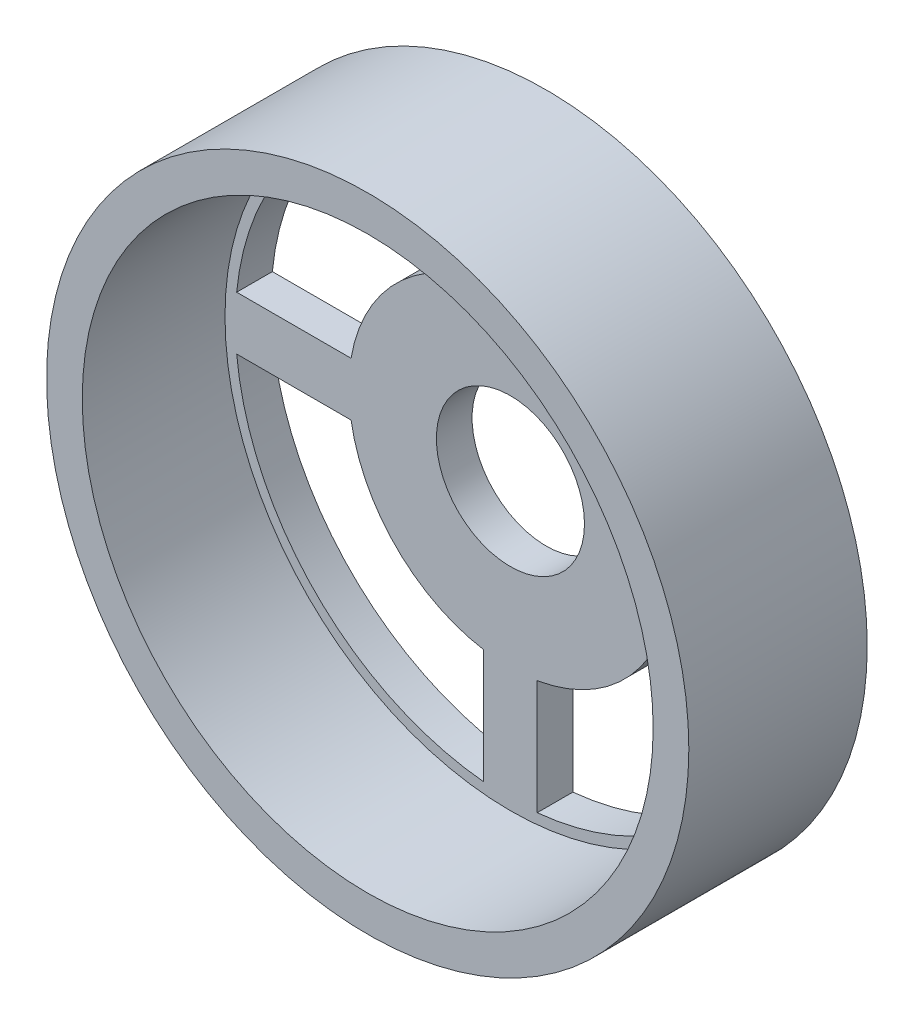
ISO-10303-21;
HEADER;
FILE_DESCRIPTION(('STEP AP214'),'2;1');
FILE_NAME('part.step','',(''),(''),'','','');
FILE_SCHEMA(('AUTOMOTIVE_DESIGN { 1 0 10303 214 1 1 1 1 }'));
ENDSEC;
DATA;
#1=APPLICATION_CONTEXT('core data for automotive mechanical design processes');
#2=APPLICATION_PROTOCOL_DEFINITION('international standard','automotive_design',2000,#1);
#3=PRODUCT_CONTEXT('',#1,'mechanical');
#4=PRODUCT('Part','Part','',(#3));
#5=PRODUCT_RELATED_PRODUCT_CATEGORY('part','',(#4));
#6=PRODUCT_DEFINITION_FORMATION('','',#4);
#7=PRODUCT_DEFINITION_CONTEXT('part definition',#1,'design');
#8=PRODUCT_DEFINITION('design','',#6,#7);
#9=PRODUCT_DEFINITION_SHAPE('','',#8);
#10=(LENGTH_UNIT() NAMED_UNIT(*) SI_UNIT(.MILLI.,.METRE.));
#11=(NAMED_UNIT(*) PLANE_ANGLE_UNIT() SI_UNIT($,.RADIAN.));
#12=(NAMED_UNIT(*) SI_UNIT($,.STERADIAN.) SOLID_ANGLE_UNIT());
#13=UNCERTAINTY_MEASURE_WITH_UNIT(LENGTH_MEASURE(1.E-05),#10,'distance_accuracy_value','');
#14=(GEOMETRIC_REPRESENTATION_CONTEXT(3) GLOBAL_UNCERTAINTY_ASSIGNED_CONTEXT((#13)) GLOBAL_UNIT_ASSIGNED_CONTEXT((#10,
#11,#12)) REPRESENTATION_CONTEXT('',''));
#15=CARTESIAN_POINT('',(0.,0.,0.));
#16=DIRECTION('',(0.,0.,1.));
#17=DIRECTION('',(1.,0.,0.));
#18=AXIS2_PLACEMENT_3D('',#15,#16,#17);
#19=CARTESIAN_POINT('',(0.,0.,2.));
#20=DIRECTION('',(0.,0.,1.));
#21=DIRECTION('',(1.,0.,0.));
#22=AXIS2_PLACEMENT_3D('',#19,#20,#21);
#23=PLANE('',#22);
#24=DIRECTION('',(0.,-1.,0.));
#25=VECTOR('',#24,1.);
#26=CARTESIAN_POINT('',(1.5,0.,2.));
#27=LINE('',#26,#25);
#28=CARTESIAN_POINT('',(1.5,15.3443381778024,2.));
#29=VERTEX_POINT('',#28);
#30=CARTESIAN_POINT('',(1.5,8.9322223454031,2.));
#31=VERTEX_POINT('',#30);
#32=EDGE_CURVE('E278',#29,#31,#27,.T.);
#33=ORIENTED_EDGE('',*,*,#32,.F.);
#34=CARTESIAN_POINT('',(0.,0.,2.));
#35=DIRECTION('',(0.,0.,1.));
#36=DIRECTION('',(1.,0.,0.));
#37=AXIS2_PLACEMENT_3D('',#34,#35,#36);
#38=CIRCLE('',#37,15.4174807966401);
#39=CARTESIAN_POINT('',(15.3443381778024,1.5,2.));
#40=VERTEX_POINT('',#39);
#41=EDGE_CURVE('E270',#40,#29,#38,.T.);
#42=ORIENTED_EDGE('',*,*,#41,.F.);
#43=DIRECTION('',(-1.,0.,0.));
#44=VECTOR('',#43,1.);
#45=CARTESIAN_POINT('',(0.,1.5,2.));
#46=LINE('',#45,#44);
#47=CARTESIAN_POINT('',(8.9322223454031,1.5,2.));
#48=VERTEX_POINT('',#47);
#49=EDGE_CURVE('E272',#40,#48,#46,.T.);
#50=ORIENTED_EDGE('',*,*,#49,.T.);
#51=CARTESIAN_POINT('',(0.,0.,2.));
#52=DIRECTION('',(0.,0.,1.));
#53=DIRECTION('',(1.,0.,0.));
#54=AXIS2_PLACEMENT_3D('',#51,#52,#53);
#55=CIRCLE('',#54,9.05729518276392);
#56=EDGE_CURVE('E275',#48,#31,#55,.T.);
#57=ORIENTED_EDGE('',*,*,#56,.T.);
#58=EDGE_LOOP('',(#33,#42,#50,#57));
#59=FACE_BOUND('',#58,.T.);
#60=DIRECTION('',(-1.,0.,0.));
#61=VECTOR('',#60,1.);
#62=CARTESIAN_POINT('',(0.,-1.5,2.));
#63=LINE('',#62,#61);
#64=CARTESIAN_POINT('',(15.3443381778024,-1.5,2.));
#65=VERTEX_POINT('',#64);
#66=CARTESIAN_POINT('',(8.9322223454031,-1.5,2.));
#67=VERTEX_POINT('',#66);
#68=EDGE_CURVE('E249',#65,#67,#63,.T.);
#69=ORIENTED_EDGE('',*,*,#68,.F.);
#70=CARTESIAN_POINT('',(0.,0.,2.));
#71=DIRECTION('',(0.,0.,1.));
#72=DIRECTION('',(1.,0.,0.));
#73=AXIS2_PLACEMENT_3D('',#70,#71,#72);
#74=CIRCLE('',#73,15.4174807966401);
#75=CARTESIAN_POINT('',(1.5,-15.3443381778024,2.));
#76=VERTEX_POINT('',#75);
#77=EDGE_CURVE('E235',#76,#65,#74,.T.);
#78=ORIENTED_EDGE('',*,*,#77,.F.);
#79=DIRECTION('',(0.,1.,0.));
#80=VECTOR('',#79,1.);
#81=CARTESIAN_POINT('',(1.5,0.,2.));
#82=LINE('',#81,#80);
#83=CARTESIAN_POINT('',(1.5,-8.9322223454031,2.));
#84=VERTEX_POINT('',#83);
#85=EDGE_CURVE('E243',#76,#84,#82,.T.);
#86=ORIENTED_EDGE('',*,*,#85,.T.);
#87=CARTESIAN_POINT('',(0.,0.,2.));
#88=DIRECTION('',(0.,0.,1.));
#89=DIRECTION('',(1.,0.,0.));
#90=AXIS2_PLACEMENT_3D('',#87,#88,#89);
#91=CIRCLE('',#90,9.05729518276392);
#92=EDGE_CURVE('E246',#84,#67,#91,.T.);
#93=ORIENTED_EDGE('',*,*,#92,.T.);
#94=EDGE_LOOP('',(#69,#78,#86,#93));
#95=FACE_BOUND('',#94,.T.);
#96=CARTESIAN_POINT('',(0.,0.,2.));
#97=DIRECTION('',(0.,0.,1.));
#98=DIRECTION('',(1.,0.,0.));
#99=AXIS2_PLACEMENT_3D('',#96,#97,#98);
#100=CIRCLE('',#99,16.);
#101=CARTESIAN_POINT('',(16.,0.,2.));
#102=VERTEX_POINT('',#101);
#103=EDGE_CURVE('E287',#102,#102,#100,.F.);
#104=ORIENTED_EDGE('',*,*,#103,.F.);
#105=EDGE_LOOP('',(#104));
#106=FACE_BOUND('',#105,.T.);
#107=CARTESIAN_POINT('',(0.,0.,2.));
#108=DIRECTION('',(0.,0.,1.));
#109=DIRECTION('',(1.,0.,0.));
#110=AXIS2_PLACEMENT_3D('',#107,#108,#109);
#111=CIRCLE('',#110,4.15);
#112=CARTESIAN_POINT('',(4.15,0.,2.));
#113=VERTEX_POINT('',#112);
#114=EDGE_CURVE('E11',#113,#113,#111,.T.);
#115=ORIENTED_EDGE('',*,*,#114,.F.);
#116=EDGE_LOOP('',(#115));
#117=FACE_BOUND('',#116,.T.);
#118=DIRECTION('',(1.,0.,0.));
#119=VECTOR('',#118,1.);
#120=CARTESIAN_POINT('',(0.,-1.5,2.));
#121=LINE('',#120,#119);
#122=CARTESIAN_POINT('',(-15.3443381778024,-1.5,2.));
#123=VERTEX_POINT('',#122);
#124=CARTESIAN_POINT('',(-8.9322223454031,-1.5,2.));
#125=VERTEX_POINT('',#124);
#126=EDGE_CURVE('E254',#123,#125,#121,.T.);
#127=ORIENTED_EDGE('',*,*,#126,.T.);
#128=CARTESIAN_POINT('',(0.,0.,2.));
#129=DIRECTION('',(0.,0.,1.));
#130=DIRECTION('',(1.,0.,0.));
#131=AXIS2_PLACEMENT_3D('',#128,#129,#130);
#132=CIRCLE('',#131,9.05729518276392);
#133=CARTESIAN_POINT('',(-1.5,-8.9322223454031,2.));
#134=VERTEX_POINT('',#133);
#135=EDGE_CURVE('E257',#125,#134,#132,.T.);
#136=ORIENTED_EDGE('',*,*,#135,.T.);
#137=DIRECTION('',(0.,1.,0.));
#138=VECTOR('',#137,1.);
#139=CARTESIAN_POINT('',(-1.5,0.,2.));
#140=LINE('',#139,#138);
#141=CARTESIAN_POINT('',(-1.5,-15.3443381778024,2.));
#142=VERTEX_POINT('',#141);
#143=EDGE_CURVE('E251',#142,#134,#140,.T.);
#144=ORIENTED_EDGE('',*,*,#143,.F.);
#145=CARTESIAN_POINT('',(0.,0.,2.));
#146=DIRECTION('',(0.,0.,1.));
#147=DIRECTION('',(1.,0.,0.));
#148=AXIS2_PLACEMENT_3D('',#145,#146,#147);
#149=CIRCLE('',#148,15.4174807966401);
#150=EDGE_CURVE('E158',#123,#142,#149,.T.);
#151=ORIENTED_EDGE('',*,*,#150,.F.);
#152=EDGE_LOOP('',(#127,#136,#144,#151));
#153=FACE_BOUND('',#152,.T.);
#154=DIRECTION('',(0.,-1.,0.));
#155=VECTOR('',#154,1.);
#156=CARTESIAN_POINT('',(-1.5,0.,2.));
#157=LINE('',#156,#155);
#158=CARTESIAN_POINT('',(-1.5,15.3443381778024,2.));
#159=VERTEX_POINT('',#158);
#160=CARTESIAN_POINT('',(-1.5,8.9322223454031,2.));
#161=VERTEX_POINT('',#160);
#162=EDGE_CURVE('E264',#159,#161,#157,.T.);
#163=ORIENTED_EDGE('',*,*,#162,.T.);
#164=CARTESIAN_POINT('',(0.,0.,2.));
#165=DIRECTION('',(0.,0.,1.));
#166=DIRECTION('',(1.,0.,0.));
#167=AXIS2_PLACEMENT_3D('',#164,#165,#166);
#168=CIRCLE('',#167,9.05729518276392);
#169=CARTESIAN_POINT('',(-8.9322223454031,1.5,2.));
#170=VERTEX_POINT('',#169);
#171=EDGE_CURVE('E267',#161,#170,#168,.T.);
#172=ORIENTED_EDGE('',*,*,#171,.T.);
#173=DIRECTION('',(1.,0.,0.));
#174=VECTOR('',#173,1.);
#175=CARTESIAN_POINT('',(0.,1.5,2.));
#176=LINE('',#175,#174);
#177=CARTESIAN_POINT('',(-15.3443381778024,1.5,2.));
#178=VERTEX_POINT('',#177);
#179=EDGE_CURVE('E260',#178,#170,#176,.T.);
#180=ORIENTED_EDGE('',*,*,#179,.F.);
#181=CARTESIAN_POINT('',(0.,0.,2.));
#182=DIRECTION('',(0.,0.,1.));
#183=DIRECTION('',(1.,0.,0.));
#184=AXIS2_PLACEMENT_3D('',#181,#182,#183);
#185=CIRCLE('',#184,15.4174807966401);
#186=EDGE_CURVE('E262',#159,#178,#185,.T.);
#187=ORIENTED_EDGE('',*,*,#186,.F.);
#188=EDGE_LOOP('',(#163,#172,#180,#187));
#189=FACE_BOUND('',#188,.T.);
#190=ADVANCED_FACE('F37',(#59,#95,#106,#117,#153,#189),#23,.T.);
#191=CARTESIAN_POINT('',(0.,0.,0.));
#192=DIRECTION('',(0.,0.,1.));
#193=DIRECTION('',(1.,0.,0.));
#194=AXIS2_PLACEMENT_3D('',#191,#192,#193);
#195=PLANE('',#194);
#196=CARTESIAN_POINT('',(0.,0.,0.));
#197=DIRECTION('',(0.,0.,-1.));
#198=DIRECTION('',(-1.,0.,0.));
#199=AXIS2_PLACEMENT_3D('',#196,#197,#198);
#200=CIRCLE('',#199,15.4174807966401);
#201=CARTESIAN_POINT('',(1.5,15.3443381778024,0.));
#202=VERTEX_POINT('',#201);
#203=CARTESIAN_POINT('',(15.3443381778024,1.5,0.));
#204=VERTEX_POINT('',#203);
#205=EDGE_CURVE('E207',#202,#204,#200,.T.);
#206=ORIENTED_EDGE('',*,*,#205,.F.);
#207=DIRECTION('',(0.,1.,0.));
#208=VECTOR('',#207,1.);
#209=CARTESIAN_POINT('',(1.5,0.,0.));
#210=LINE('',#209,#208);
#211=CARTESIAN_POINT('',(1.5,8.9322223454031,0.));
#212=VERTEX_POINT('',#211);
#213=EDGE_CURVE('E205',#212,#202,#210,.T.);
#214=ORIENTED_EDGE('',*,*,#213,.F.);
#215=CARTESIAN_POINT('',(0.,0.,0.));
#216=DIRECTION('',(0.,0.,-1.));
#217=DIRECTION('',(-1.,0.,0.));
#218=AXIS2_PLACEMENT_3D('',#215,#216,#217);
#219=CIRCLE('',#218,9.05729518276392);
#220=CARTESIAN_POINT('',(8.9322223454031,1.5,0.));
#221=VERTEX_POINT('',#220);
#222=EDGE_CURVE('E212',#212,#221,#219,.T.);
#223=ORIENTED_EDGE('',*,*,#222,.T.);
#224=DIRECTION('',(1.,0.,0.));
#225=VECTOR('',#224,1.);
#226=CARTESIAN_POINT('',(0.,1.5,0.));
#227=LINE('',#226,#225);
#228=EDGE_CURVE('E209',#221,#204,#227,.T.);
#229=ORIENTED_EDGE('',*,*,#228,.T.);
#230=EDGE_LOOP('',(#206,#214,#223,#229));
#231=FACE_BOUND('',#230,.T.);
#232=CARTESIAN_POINT('',(0.,0.,0.));
#233=DIRECTION('',(0.,0.,-1.));
#234=DIRECTION('',(-1.,0.,0.));
#235=AXIS2_PLACEMENT_3D('',#232,#233,#234);
#236=CIRCLE('',#235,9.05729518276392);
#237=CARTESIAN_POINT('',(-1.5,-8.9322223454031,0.));
#238=VERTEX_POINT('',#237);
#239=CARTESIAN_POINT('',(-8.9322223454031,-1.5,0.));
#240=VERTEX_POINT('',#239);
#241=EDGE_CURVE('E171',#238,#240,#236,.T.);
#242=ORIENTED_EDGE('',*,*,#241,.T.);
#243=DIRECTION('',(-1.,0.,0.));
#244=VECTOR('',#243,1.);
#245=CARTESIAN_POINT('',(0.,-1.5,0.));
#246=LINE('',#245,#244);
#247=CARTESIAN_POINT('',(-15.3443381778024,-1.5,0.));
#248=VERTEX_POINT('',#247);
#249=EDGE_CURVE('E175',#240,#248,#246,.T.);
#250=ORIENTED_EDGE('',*,*,#249,.T.);
#251=CARTESIAN_POINT('',(0.,0.,0.));
#252=DIRECTION('',(0.,0.,-1.));
#253=DIRECTION('',(-1.,0.,0.));
#254=AXIS2_PLACEMENT_3D('',#251,#252,#253);
#255=CIRCLE('',#254,15.4174807966401);
#256=CARTESIAN_POINT('',(-1.5,-15.3443381778024,0.));
#257=VERTEX_POINT('',#256);
#258=EDGE_CURVE('E155',#257,#248,#255,.T.);
#259=ORIENTED_EDGE('',*,*,#258,.F.);
#260=DIRECTION('',(0.,-1.,0.));
#261=VECTOR('',#260,1.);
#262=CARTESIAN_POINT('',(-1.5,0.,0.));
#263=LINE('',#262,#261);
#264=EDGE_CURVE('E166',#238,#257,#263,.T.);
#265=ORIENTED_EDGE('',*,*,#264,.F.);
#266=EDGE_LOOP('',(#242,#250,#259,#265));
#267=FACE_BOUND('',#266,.T.);
#268=CARTESIAN_POINT('',(0.,0.,0.));
#269=DIRECTION('',(0.,0.,-1.));
#270=DIRECTION('',(-1.,0.,0.));
#271=AXIS2_PLACEMENT_3D('',#268,#269,#270);
#272=CIRCLE('',#271,15.4174807966401);
#273=CARTESIAN_POINT('',(15.3443381778024,-1.5,0.));
#274=VERTEX_POINT('',#273);
#275=CARTESIAN_POINT('',(1.5,-15.3443381778024,0.));
#276=VERTEX_POINT('',#275);
#277=EDGE_CURVE('E223',#274,#276,#272,.T.);
#278=ORIENTED_EDGE('',*,*,#277,.F.);
#279=DIRECTION('',(1.,0.,0.));
#280=VECTOR('',#279,1.);
#281=CARTESIAN_POINT('',(0.,-1.5,0.));
#282=LINE('',#281,#280);
#283=CARTESIAN_POINT('',(8.9322223454031,-1.5,0.));
#284=VERTEX_POINT('',#283);
#285=EDGE_CURVE('E182',#284,#274,#282,.T.);
#286=ORIENTED_EDGE('',*,*,#285,.F.);
#287=CARTESIAN_POINT('',(0.,0.,0.));
#288=DIRECTION('',(0.,0.,-1.));
#289=DIRECTION('',(-1.,0.,0.));
#290=AXIS2_PLACEMENT_3D('',#287,#288,#289);
#291=CIRCLE('',#290,9.05729518276392);
#292=CARTESIAN_POINT('',(1.5,-8.9322223454031,0.));
#293=VERTEX_POINT('',#292);
#294=EDGE_CURVE('E229',#284,#293,#291,.T.);
#295=ORIENTED_EDGE('',*,*,#294,.T.);
#296=DIRECTION('',(0.,-1.,0.));
#297=VECTOR('',#296,1.);
#298=CARTESIAN_POINT('',(1.5,0.,0.));
#299=LINE('',#298,#297);
#300=EDGE_CURVE('E226',#293,#276,#299,.T.);
#301=ORIENTED_EDGE('',*,*,#300,.T.);
#302=EDGE_LOOP('',(#278,#286,#295,#301));
#303=FACE_BOUND('',#302,.T.);
#304=CARTESIAN_POINT('',(0.,0.,0.));
#305=DIRECTION('',(0.,0.,1.));
#306=DIRECTION('',(1.,0.,0.));
#307=AXIS2_PLACEMENT_3D('',#304,#305,#306);
#308=CIRCLE('',#307,4.15);
#309=CARTESIAN_POINT('',(4.15,0.,0.));
#310=VERTEX_POINT('',#309);
#311=EDGE_CURVE('E41',#310,#310,#308,.T.);
#312=ORIENTED_EDGE('',*,*,#311,.T.);
#313=EDGE_LOOP('',(#312));
#314=FACE_BOUND('',#313,.T.);
#315=CARTESIAN_POINT('',(0.,0.,0.));
#316=DIRECTION('',(0.,0.,1.));
#317=DIRECTION('',(1.,0.,0.));
#318=AXIS2_PLACEMENT_3D('',#315,#316,#317);
#319=CIRCLE('',#318,18.);
#320=CARTESIAN_POINT('',(18.,0.,0.));
#321=VERTEX_POINT('',#320);
#322=EDGE_CURVE('E283',#321,#321,#319,.T.);
#323=ORIENTED_EDGE('',*,*,#322,.F.);
#324=EDGE_LOOP('',(#323));
#325=FACE_BOUND('',#324,.T.);
#326=CARTESIAN_POINT('',(0.,0.,0.));
#327=DIRECTION('',(0.,0.,-1.));
#328=DIRECTION('',(-1.,0.,0.));
#329=AXIS2_PLACEMENT_3D('',#326,#327,#328);
#330=CIRCLE('',#329,9.05729518276392);
#331=CARTESIAN_POINT('',(-8.9322223454031,1.5,0.));
#332=VERTEX_POINT('',#331);
#333=CARTESIAN_POINT('',(-1.5,8.9322223454031,0.));
#334=VERTEX_POINT('',#333);
#335=EDGE_CURVE('E185',#332,#334,#330,.T.);
#336=ORIENTED_EDGE('',*,*,#335,.T.);
#337=DIRECTION('',(0.,1.,0.));
#338=VECTOR('',#337,1.);
#339=CARTESIAN_POINT('',(-1.5,0.,0.));
#340=LINE('',#339,#338);
#341=CARTESIAN_POINT('',(-1.5,15.3443381778024,0.));
#342=VERTEX_POINT('',#341);
#343=EDGE_CURVE('E194',#334,#342,#340,.T.);
#344=ORIENTED_EDGE('',*,*,#343,.T.);
#345=CARTESIAN_POINT('',(0.,0.,0.));
#346=DIRECTION('',(0.,0.,-1.));
#347=DIRECTION('',(-1.,0.,0.));
#348=AXIS2_PLACEMENT_3D('',#345,#346,#347);
#349=CIRCLE('',#348,15.4174807966401);
#350=CARTESIAN_POINT('',(-15.3443381778024,1.5,0.));
#351=VERTEX_POINT('',#350);
#352=EDGE_CURVE('E191',#351,#342,#349,.T.);
#353=ORIENTED_EDGE('',*,*,#352,.F.);
#354=DIRECTION('',(-1.,0.,0.));
#355=VECTOR('',#354,1.);
#356=CARTESIAN_POINT('',(0.,1.5,0.));
#357=LINE('',#356,#355);
#358=EDGE_CURVE('E188',#332,#351,#357,.T.);
#359=ORIENTED_EDGE('',*,*,#358,.F.);
#360=EDGE_LOOP('',(#336,#344,#353,#359));
#361=FACE_BOUND('',#360,.T.);
#362=ADVANCED_FACE('F39',(#231,#267,#303,#314,#325,#361),#195,.F.);
#363=CARTESIAN_POINT('',(0.,0.,2.));
#364=DIRECTION('',(0.,0.,-1.));
#365=DIRECTION('',(-1.,0.,0.));
#366=AXIS2_PLACEMENT_3D('',#363,#364,#365);
#367=CYLINDRICAL_SURFACE('',#366,4.15);
#368=ORIENTED_EDGE('',*,*,#114,.T.);
#369=EDGE_LOOP('',(#368));
#370=FACE_BOUND('',#369,.T.);
#371=ORIENTED_EDGE('',*,*,#311,.F.);
#372=EDGE_LOOP('',(#371));
#373=FACE_BOUND('',#372,.T.);
#374=ADVANCED_FACE('F298',(#370,#373),#367,.F.);
#375=CARTESIAN_POINT('',(0.,0.,10.));
#376=DIRECTION('',(0.,0.,1.));
#377=DIRECTION('',(1.,0.,0.));
#378=AXIS2_PLACEMENT_3D('',#375,#376,#377);
#379=PLANE('',#378);
#380=CARTESIAN_POINT('',(0.,0.,10.));
#381=DIRECTION('',(0.,0.,1.));
#382=DIRECTION('',(1.,0.,0.));
#383=AXIS2_PLACEMENT_3D('',#380,#381,#382);
#384=CIRCLE('',#383,18.);
#385=CARTESIAN_POINT('',(18.,0.,10.));
#386=VERTEX_POINT('',#385);
#387=EDGE_CURVE('E284',#386,#386,#384,.T.);
#388=ORIENTED_EDGE('',*,*,#387,.T.);
#389=EDGE_LOOP('',(#388));
#390=FACE_BOUND('',#389,.T.);
#391=CARTESIAN_POINT('',(0.,0.,10.));
#392=DIRECTION('',(0.,0.,1.));
#393=DIRECTION('',(1.,0.,0.));
#394=AXIS2_PLACEMENT_3D('',#391,#392,#393);
#395=CIRCLE('',#394,16.);
#396=CARTESIAN_POINT('',(16.,0.,10.));
#397=VERTEX_POINT('',#396);
#398=EDGE_CURVE('E280',#397,#397,#395,.T.);
#399=ORIENTED_EDGE('',*,*,#398,.F.);
#400=EDGE_LOOP('',(#399));
#401=FACE_BOUND('',#400,.T.);
#402=ADVANCED_FACE('F300',(#390,#401),#379,.T.);
#403=CARTESIAN_POINT('',(0.,0.,10.));
#404=DIRECTION('',(0.,0.,-1.));
#405=DIRECTION('',(-1.,0.,0.));
#406=AXIS2_PLACEMENT_3D('',#403,#404,#405);
#407=CYLINDRICAL_SURFACE('',#406,18.);
#408=ORIENTED_EDGE('',*,*,#387,.F.);
#409=EDGE_LOOP('',(#408));
#410=FACE_BOUND('',#409,.T.);
#411=ORIENTED_EDGE('',*,*,#322,.T.);
#412=EDGE_LOOP('',(#411));
#413=FACE_BOUND('',#412,.T.);
#414=ADVANCED_FACE('F307',(#410,#413),#407,.T.);
#415=CARTESIAN_POINT('',(0.,0.,10.));
#416=DIRECTION('',(0.,0.,-1.));
#417=DIRECTION('',(-1.,0.,0.));
#418=AXIS2_PLACEMENT_3D('',#415,#416,#417);
#419=CYLINDRICAL_SURFACE('',#418,16.);
#420=ORIENTED_EDGE('',*,*,#103,.T.);
#421=EDGE_LOOP('',(#420));
#422=FACE_BOUND('',#421,.T.);
#423=ORIENTED_EDGE('',*,*,#398,.T.);
#424=EDGE_LOOP('',(#423));
#425=FACE_BOUND('',#424,.T.);
#426=ADVANCED_FACE('F383',(#422,#425),#419,.F.);
#427=CARTESIAN_POINT('',(0.,-1.5,10.));
#428=DIRECTION('',(0.,1.,0.));
#429=DIRECTION('',(0.,0.,1.));
#430=AXIS2_PLACEMENT_3D('',#427,#428,#429);
#431=PLANE('',#430);
#432=ORIENTED_EDGE('',*,*,#68,.T.);
#433=DIRECTION('',(0.,0.,-1.));
#434=VECTOR('',#433,1.);
#435=CARTESIAN_POINT('',(8.9322223454031,-1.5,10.));
#436=LINE('',#435,#434);
#437=EDGE_CURVE('E233',#67,#284,#436,.T.);
#438=ORIENTED_EDGE('',*,*,#437,.T.);
#439=ORIENTED_EDGE('',*,*,#285,.T.);
#440=DIRECTION('',(0.,0.,-1.));
#441=VECTOR('',#440,1.);
#442=CARTESIAN_POINT('',(15.3443381778024,-1.5,10.));
#443=LINE('',#442,#441);
#444=EDGE_CURVE('E232',#65,#274,#443,.T.);
#445=ORIENTED_EDGE('',*,*,#444,.F.);
#446=EDGE_LOOP('',(#432,#438,#439,#445));
#447=FACE_BOUND('',#446,.T.);
#448=ADVANCED_FACE('F371',(#447),#431,.F.);
#449=CARTESIAN_POINT('',(0.,0.,10.));
#450=DIRECTION('',(0.,0.,-1.));
#451=DIRECTION('',(-1.,0.,0.));
#452=AXIS2_PLACEMENT_3D('',#449,#450,#451);
#453=CYLINDRICAL_SURFACE('',#452,9.05729518276392);
#454=DIRECTION('',(0.,0.,-1.));
#455=VECTOR('',#454,1.);
#456=CARTESIAN_POINT('',(1.5,-8.9322223454031,10.));
#457=LINE('',#456,#455);
#458=EDGE_CURVE('E236',#84,#293,#457,.T.);
#459=ORIENTED_EDGE('',*,*,#458,.T.);
#460=ORIENTED_EDGE('',*,*,#294,.F.);
#461=ORIENTED_EDGE('',*,*,#437,.F.);
#462=ORIENTED_EDGE('',*,*,#92,.F.);
#463=EDGE_LOOP('',(#459,#460,#461,#462));
#464=FACE_BOUND('',#463,.T.);
#465=ADVANCED_FACE('F367',(#464),#453,.T.);
#466=CARTESIAN_POINT('',(1.5,0.,10.));
#467=DIRECTION('',(1.,0.,0.));
#468=DIRECTION('',(0.,0.,-1.));
#469=AXIS2_PLACEMENT_3D('',#466,#467,#468);
#470=PLANE('',#469);
#471=DIRECTION('',(0.,0.,-1.));
#472=VECTOR('',#471,1.);
#473=CARTESIAN_POINT('',(1.5,-15.3443381778024,10.));
#474=LINE('',#473,#472);
#475=EDGE_CURVE('E238',#76,#276,#474,.T.);
#476=ORIENTED_EDGE('',*,*,#475,.T.);
#477=ORIENTED_EDGE('',*,*,#300,.F.);
#478=ORIENTED_EDGE('',*,*,#458,.F.);
#479=ORIENTED_EDGE('',*,*,#85,.F.);
#480=EDGE_LOOP('',(#476,#477,#478,#479));
#481=FACE_BOUND('',#480,.T.);
#482=ADVANCED_FACE('F370',(#481),#470,.T.);
#483=CARTESIAN_POINT('',(0.,0.,10.));
#484=DIRECTION('',(0.,0.,-1.));
#485=DIRECTION('',(-1.,0.,0.));
#486=AXIS2_PLACEMENT_3D('',#483,#484,#485);
#487=CYLINDRICAL_SURFACE('',#486,15.4174807966401);
#488=ORIENTED_EDGE('',*,*,#77,.T.);
#489=ORIENTED_EDGE('',*,*,#444,.T.);
#490=ORIENTED_EDGE('',*,*,#277,.T.);
#491=ORIENTED_EDGE('',*,*,#475,.F.);
#492=EDGE_LOOP('',(#488,#489,#490,#491));
#493=FACE_BOUND('',#492,.T.);
#494=ADVANCED_FACE('F375',(#493),#487,.F.);
#495=CARTESIAN_POINT('',(0.,0.,10.));
#496=DIRECTION('',(0.,0.,-1.));
#497=DIRECTION('',(-1.,0.,0.));
#498=AXIS2_PLACEMENT_3D('',#495,#496,#497);
#499=CYLINDRICAL_SURFACE('',#498,9.05729518276392);
#500=DIRECTION('',(0.,0.,-1.));
#501=VECTOR('',#500,1.);
#502=CARTESIAN_POINT('',(-8.9322223454031,-1.5,10.));
#503=LINE('',#502,#501);
#504=EDGE_CURVE('E180',#125,#240,#503,.T.);
#505=ORIENTED_EDGE('',*,*,#504,.T.);
#506=ORIENTED_EDGE('',*,*,#241,.F.);
#507=DIRECTION('',(0.,0.,-1.));
#508=VECTOR('',#507,1.);
#509=CARTESIAN_POINT('',(-1.5,-8.9322223454031,10.));
#510=LINE('',#509,#508);
#511=EDGE_CURVE('E162',#134,#238,#510,.T.);
#512=ORIENTED_EDGE('',*,*,#511,.F.);
#513=ORIENTED_EDGE('',*,*,#135,.F.);
#514=EDGE_LOOP('',(#505,#506,#512,#513));
#515=FACE_BOUND('',#514,.T.);
#516=ADVANCED_FACE('F379',(#515),#499,.T.);
#517=CARTESIAN_POINT('',(0.,-1.5,10.));
#518=DIRECTION('',(0.,-1.,0.));
#519=DIRECTION('',(0.,0.,-1.));
#520=AXIS2_PLACEMENT_3D('',#517,#518,#519);
#521=PLANE('',#520);
#522=DIRECTION('',(0.,0.,-1.));
#523=VECTOR('',#522,1.);
#524=CARTESIAN_POINT('',(-15.3443381778024,-1.5,10.));
#525=LINE('',#524,#523);
#526=EDGE_CURVE('E161',#123,#248,#525,.T.);
#527=ORIENTED_EDGE('',*,*,#526,.T.);
#528=ORIENTED_EDGE('',*,*,#249,.F.);
#529=ORIENTED_EDGE('',*,*,#504,.F.);
#530=ORIENTED_EDGE('',*,*,#126,.F.);
#531=EDGE_LOOP('',(#527,#528,#529,#530));
#532=FACE_BOUND('',#531,.T.);
#533=ADVANCED_FACE('F425',(#532),#521,.T.);
#534=CARTESIAN_POINT('',(0.,0.,10.));
#535=DIRECTION('',(0.,0.,-1.));
#536=DIRECTION('',(-1.,0.,0.));
#537=AXIS2_PLACEMENT_3D('',#534,#535,#536);
#538=CYLINDRICAL_SURFACE('',#537,15.4174807966401);
#539=ORIENTED_EDGE('',*,*,#150,.T.);
#540=DIRECTION('',(0.,0.,-1.));
#541=VECTOR('',#540,1.);
#542=CARTESIAN_POINT('',(-1.5,-15.3443381778024,10.));
#543=LINE('',#542,#541);
#544=EDGE_CURVE('E150',#142,#257,#543,.T.);
#545=ORIENTED_EDGE('',*,*,#544,.T.);
#546=ORIENTED_EDGE('',*,*,#258,.T.);
#547=ORIENTED_EDGE('',*,*,#526,.F.);
#548=EDGE_LOOP('',(#539,#545,#546,#547));
#549=FACE_BOUND('',#548,.T.);
#550=ADVANCED_FACE('F152',(#549),#538,.F.);
#551=CARTESIAN_POINT('',(-1.5,0.,10.));
#552=DIRECTION('',(1.,0.,0.));
#553=DIRECTION('',(0.,0.,-1.));
#554=AXIS2_PLACEMENT_3D('',#551,#552,#553);
#555=PLANE('',#554);
#556=ORIENTED_EDGE('',*,*,#143,.T.);
#557=ORIENTED_EDGE('',*,*,#511,.T.);
#558=ORIENTED_EDGE('',*,*,#264,.T.);
#559=ORIENTED_EDGE('',*,*,#544,.F.);
#560=EDGE_LOOP('',(#556,#557,#558,#559));
#561=FACE_BOUND('',#560,.T.);
#562=ADVANCED_FACE('F167',(#561),#555,.F.);
#563=CARTESIAN_POINT('',(0.,0.,10.));
#564=DIRECTION('',(0.,0.,-1.));
#565=DIRECTION('',(-1.,0.,0.));
#566=AXIS2_PLACEMENT_3D('',#563,#564,#565);
#567=CYLINDRICAL_SURFACE('',#566,9.05729518276392);
#568=DIRECTION('',(0.,0.,-1.));
#569=VECTOR('',#568,1.);
#570=CARTESIAN_POINT('',(-1.5,8.9322223454031,10.));
#571=LINE('',#570,#569);
#572=EDGE_CURVE('E198',#161,#334,#571,.T.);
#573=ORIENTED_EDGE('',*,*,#572,.T.);
#574=ORIENTED_EDGE('',*,*,#335,.F.);
#575=DIRECTION('',(0.,0.,-1.));
#576=VECTOR('',#575,1.);
#577=CARTESIAN_POINT('',(-8.9322223454031,1.5,10.));
#578=LINE('',#577,#576);
#579=EDGE_CURVE('E197',#170,#332,#578,.T.);
#580=ORIENTED_EDGE('',*,*,#579,.F.);
#581=ORIENTED_EDGE('',*,*,#171,.F.);
#582=EDGE_LOOP('',(#573,#574,#580,#581));
#583=FACE_BOUND('',#582,.T.);
#584=ADVANCED_FACE('F340',(#583),#567,.T.);
#585=CARTESIAN_POINT('',(-1.5,0.,10.));
#586=DIRECTION('',(-1.,0.,0.));
#587=DIRECTION('',(0.,0.,1.));
#588=AXIS2_PLACEMENT_3D('',#585,#586,#587);
#589=PLANE('',#588);
#590=DIRECTION('',(0.,0.,-1.));
#591=VECTOR('',#590,1.);
#592=CARTESIAN_POINT('',(-1.5,15.3443381778024,10.));
#593=LINE('',#592,#591);
#594=EDGE_CURVE('E200',#159,#342,#593,.T.);
#595=ORIENTED_EDGE('',*,*,#594,.T.);
#596=ORIENTED_EDGE('',*,*,#343,.F.);
#597=ORIENTED_EDGE('',*,*,#572,.F.);
#598=ORIENTED_EDGE('',*,*,#162,.F.);
#599=EDGE_LOOP('',(#595,#596,#597,#598));
#600=FACE_BOUND('',#599,.T.);
#601=ADVANCED_FACE('F331',(#600),#589,.T.);
#602=CARTESIAN_POINT('',(0.,0.,10.));
#603=DIRECTION('',(0.,0.,-1.));
#604=DIRECTION('',(-1.,0.,0.));
#605=AXIS2_PLACEMENT_3D('',#602,#603,#604);
#606=CYLINDRICAL_SURFACE('',#605,15.4174807966401);
#607=ORIENTED_EDGE('',*,*,#186,.T.);
#608=DIRECTION('',(0.,0.,-1.));
#609=VECTOR('',#608,1.);
#610=CARTESIAN_POINT('',(-15.3443381778024,1.5,10.));
#611=LINE('',#610,#609);
#612=EDGE_CURVE('E60',#178,#351,#611,.T.);
#613=ORIENTED_EDGE('',*,*,#612,.T.);
#614=ORIENTED_EDGE('',*,*,#352,.T.);
#615=ORIENTED_EDGE('',*,*,#594,.F.);
#616=EDGE_LOOP('',(#607,#613,#614,#615));
#617=FACE_BOUND('',#616,.T.);
#618=ADVANCED_FACE('F334',(#617),#606,.F.);
#619=CARTESIAN_POINT('',(0.,1.5,10.));
#620=DIRECTION('',(0.,-1.,0.));
#621=DIRECTION('',(0.,0.,-1.));
#622=AXIS2_PLACEMENT_3D('',#619,#620,#621);
#623=PLANE('',#622);
#624=ORIENTED_EDGE('',*,*,#179,.T.);
#625=ORIENTED_EDGE('',*,*,#579,.T.);
#626=ORIENTED_EDGE('',*,*,#358,.T.);
#627=ORIENTED_EDGE('',*,*,#612,.F.);
#628=EDGE_LOOP('',(#624,#625,#626,#627));
#629=FACE_BOUND('',#628,.T.);
#630=ADVANCED_FACE('F341',(#629),#623,.F.);
#631=CARTESIAN_POINT('',(1.5,0.,10.));
#632=DIRECTION('',(-1.,0.,0.));
#633=DIRECTION('',(0.,0.,1.));
#634=AXIS2_PLACEMENT_3D('',#631,#632,#633);
#635=PLANE('',#634);
#636=ORIENTED_EDGE('',*,*,#32,.T.);
#637=DIRECTION('',(0.,0.,-1.));
#638=VECTOR('',#637,1.);
#639=CARTESIAN_POINT('',(1.5,8.9322223454031,10.));
#640=LINE('',#639,#638);
#641=EDGE_CURVE('E189',#31,#212,#640,.T.);
#642=ORIENTED_EDGE('',*,*,#641,.T.);
#643=ORIENTED_EDGE('',*,*,#213,.T.);
#644=DIRECTION('',(0.,0.,-1.));
#645=VECTOR('',#644,1.);
#646=CARTESIAN_POINT('',(1.5,15.3443381778024,10.));
#647=LINE('',#646,#645);
#648=EDGE_CURVE('E215',#29,#202,#647,.T.);
#649=ORIENTED_EDGE('',*,*,#648,.F.);
#650=EDGE_LOOP('',(#636,#642,#643,#649));
#651=FACE_BOUND('',#650,.T.);
#652=ADVANCED_FACE('F343',(#651),#635,.F.);
#653=CARTESIAN_POINT('',(0.,0.,10.));
#654=DIRECTION('',(0.,0.,-1.));
#655=DIRECTION('',(-1.,0.,0.));
#656=AXIS2_PLACEMENT_3D('',#653,#654,#655);
#657=CYLINDRICAL_SURFACE('',#656,9.05729518276392);
#658=DIRECTION('',(0.,0.,-1.));
#659=VECTOR('',#658,1.);
#660=CARTESIAN_POINT('',(8.9322223454031,1.5,10.));
#661=LINE('',#660,#659);
#662=EDGE_CURVE('E217',#48,#221,#661,.T.);
#663=ORIENTED_EDGE('',*,*,#662,.T.);
#664=ORIENTED_EDGE('',*,*,#222,.F.);
#665=ORIENTED_EDGE('',*,*,#641,.F.);
#666=ORIENTED_EDGE('',*,*,#56,.F.);
#667=EDGE_LOOP('',(#663,#664,#665,#666));
#668=FACE_BOUND('',#667,.T.);
#669=ADVANCED_FACE('F349',(#668),#657,.T.);
#670=CARTESIAN_POINT('',(0.,1.5,10.));
#671=DIRECTION('',(0.,1.,0.));
#672=DIRECTION('',(0.,0.,1.));
#673=AXIS2_PLACEMENT_3D('',#670,#671,#672);
#674=PLANE('',#673);
#675=DIRECTION('',(0.,0.,-1.));
#676=VECTOR('',#675,1.);
#677=CARTESIAN_POINT('',(15.3443381778024,1.5,10.));
#678=LINE('',#677,#676);
#679=EDGE_CURVE('E52',#40,#204,#678,.T.);
#680=ORIENTED_EDGE('',*,*,#679,.T.);
#681=ORIENTED_EDGE('',*,*,#228,.F.);
#682=ORIENTED_EDGE('',*,*,#662,.F.);
#683=ORIENTED_EDGE('',*,*,#49,.F.);
#684=EDGE_LOOP('',(#680,#681,#682,#683));
#685=FACE_BOUND('',#684,.T.);
#686=ADVANCED_FACE('F359',(#685),#674,.T.);
#687=CARTESIAN_POINT('',(0.,0.,10.));
#688=DIRECTION('',(0.,0.,-1.));
#689=DIRECTION('',(-1.,0.,0.));
#690=AXIS2_PLACEMENT_3D('',#687,#688,#689);
#691=CYLINDRICAL_SURFACE('',#690,15.4174807966401);
#692=ORIENTED_EDGE('',*,*,#41,.T.);
#693=ORIENTED_EDGE('',*,*,#648,.T.);
#694=ORIENTED_EDGE('',*,*,#205,.T.);
#695=ORIENTED_EDGE('',*,*,#679,.F.);
#696=EDGE_LOOP('',(#692,#693,#694,#695));
#697=FACE_BOUND('',#696,.T.);
#698=ADVANCED_FACE('F363',(#697),#691,.F.);
#699=CLOSED_SHELL('',(#190,#362,#374,#402,#414,#426,#448,#465,#482,#494,#516,#533,#550,#562,
#584,#601,#618,#630,#652,#669,#686,#698));
#700=MANIFOLD_SOLID_BREP('B2',#699);
#701=ADVANCED_BREP_SHAPE_REPRESENTATION('',(#18,#700),#14);
#702=SHAPE_DEFINITION_REPRESENTATION(#9,#701);
ENDSEC;
END-ISO-10303-21;
